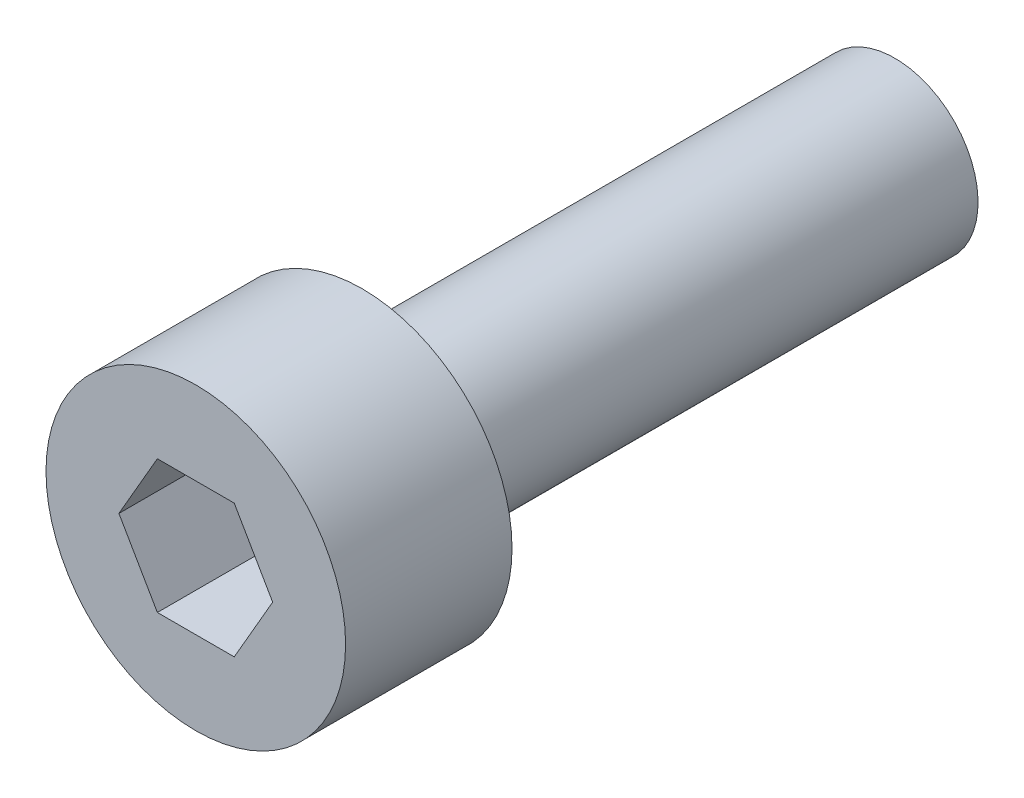
ISO-10303-21;
HEADER;
FILE_DESCRIPTION(('STEP AP214'),'2;1');
FILE_NAME('part.step','',(''),(''),'','','');
FILE_SCHEMA(('AUTOMOTIVE_DESIGN { 1 0 10303 214 1 1 1 1 }'));
ENDSEC;
DATA;
#1=APPLICATION_CONTEXT('core data for automotive mechanical design processes');
#2=APPLICATION_PROTOCOL_DEFINITION('international standard','automotive_design',2000,#1);
#3=PRODUCT_CONTEXT('',#1,'mechanical');
#4=PRODUCT('Part','Part','',(#3));
#5=PRODUCT_RELATED_PRODUCT_CATEGORY('part','',(#4));
#6=PRODUCT_DEFINITION_FORMATION('','',#4);
#7=PRODUCT_DEFINITION_CONTEXT('part definition',#1,'design');
#8=PRODUCT_DEFINITION('design','',#6,#7);
#9=PRODUCT_DEFINITION_SHAPE('','',#8);
#10=(LENGTH_UNIT() NAMED_UNIT(*) SI_UNIT(.MILLI.,.METRE.));
#11=(NAMED_UNIT(*) PLANE_ANGLE_UNIT() SI_UNIT($,.RADIAN.));
#12=(NAMED_UNIT(*) SI_UNIT($,.STERADIAN.) SOLID_ANGLE_UNIT());
#13=UNCERTAINTY_MEASURE_WITH_UNIT(LENGTH_MEASURE(1.E-05),#10,'distance_accuracy_value','');
#14=(GEOMETRIC_REPRESENTATION_CONTEXT(3) GLOBAL_UNCERTAINTY_ASSIGNED_CONTEXT((#13)) GLOBAL_UNIT_ASSIGNED_CONTEXT((#10,
#11,#12)) REPRESENTATION_CONTEXT('',''));
#15=CARTESIAN_POINT('',(0.,0.,0.));
#16=DIRECTION('',(0.,0.,1.));
#17=DIRECTION('',(1.,0.,0.));
#18=AXIS2_PLACEMENT_3D('',#15,#16,#17);
#19=CARTESIAN_POINT('',(0.,0.,2.5));
#20=DIRECTION('',(0.,0.,-1.));
#21=DIRECTION('',(0.,1.,0.));
#22=AXIS2_PLACEMENT_3D('',#19,#20,#21);
#23=PLANE('',#22);
#24=DIRECTION('',(0.5,0.866025403784439,0.));
#25=VECTOR('',#24,1.);
#26=CARTESIAN_POINT('',(0.577350269189626,-1.,2.5));
#27=LINE('',#26,#25);
#28=CARTESIAN_POINT('',(0.577350269189626,-1.,2.5));
#29=VERTEX_POINT('',#28);
#30=CARTESIAN_POINT('',(1.15470053837925,0.,2.5));
#31=VERTEX_POINT('',#30);
#32=EDGE_CURVE('E124',#29,#31,#27,.T.);
#33=ORIENTED_EDGE('',*,*,#32,.F.);
#34=DIRECTION('',(1.,0.,0.));
#35=VECTOR('',#34,1.);
#36=CARTESIAN_POINT('',(-0.577350269189626,-1.,2.5));
#37=LINE('',#36,#35);
#38=CARTESIAN_POINT('',(-0.577350269189626,-1.,2.5));
#39=VERTEX_POINT('',#38);
#40=EDGE_CURVE('E50',#39,#29,#37,.T.);
#41=ORIENTED_EDGE('',*,*,#40,.F.);
#42=DIRECTION('',(0.5,-0.866025403784439,0.));
#43=VECTOR('',#42,1.);
#44=CARTESIAN_POINT('',(-1.15470053837925,0.,2.5));
#45=LINE('',#44,#43);
#46=CARTESIAN_POINT('',(-1.15470053837925,0.,2.5));
#47=VERTEX_POINT('',#46);
#48=EDGE_CURVE('E133',#47,#39,#45,.T.);
#49=ORIENTED_EDGE('',*,*,#48,.F.);
#50=DIRECTION('',(-0.5,-0.866025403784439,0.));
#51=VECTOR('',#50,1.);
#52=CARTESIAN_POINT('',(-0.577350269189626,1.,2.5));
#53=LINE('',#52,#51);
#54=CARTESIAN_POINT('',(-0.577350269189626,1.,2.5));
#55=VERTEX_POINT('',#54);
#56=EDGE_CURVE('E131',#55,#47,#53,.T.);
#57=ORIENTED_EDGE('',*,*,#56,.F.);
#58=DIRECTION('',(-1.,0.,0.));
#59=VECTOR('',#58,1.);
#60=CARTESIAN_POINT('',(0.577350269189626,1.,2.5));
#61=LINE('',#60,#59);
#62=CARTESIAN_POINT('',(0.577350269189626,1.,2.5));
#63=VERTEX_POINT('',#62);
#64=EDGE_CURVE('E98',#63,#55,#61,.T.);
#65=ORIENTED_EDGE('',*,*,#64,.F.);
#66=DIRECTION('',(-0.5,0.866025403784439,0.));
#67=VECTOR('',#66,1.);
#68=CARTESIAN_POINT('',(1.15470053837925,0.,2.5));
#69=LINE('',#68,#67);
#70=EDGE_CURVE('E127',#31,#63,#69,.T.);
#71=ORIENTED_EDGE('',*,*,#70,.F.);
#72=EDGE_LOOP('',(#33,#41,#49,#57,#65,#71));
#73=FACE_BOUND('',#72,.T.);
#74=CARTESIAN_POINT('',(0.,0.,2.5));
#75=DIRECTION('',(0.,0.,1.));
#76=DIRECTION('',(0.,-1.,0.));
#77=AXIS2_PLACEMENT_3D('',#74,#75,#76);
#78=CIRCLE('',#77,2.25);
#79=CARTESIAN_POINT('',(0.,-2.25,2.5));
#80=VERTEX_POINT('',#79);
#81=EDGE_CURVE('E11',#80,#80,#78,.T.);
#82=ORIENTED_EDGE('',*,*,#81,.T.);
#83=EDGE_LOOP('',(#82));
#84=FACE_BOUND('',#83,.T.);
#85=ADVANCED_FACE('F36',(#73,#84),#23,.F.);
#86=CARTESIAN_POINT('',(0.,0.,5.58488227818494));
#87=DIRECTION('',(0.,0.,1.));
#88=DIRECTION('',(0.,-1.,0.));
#89=AXIS2_PLACEMENT_3D('',#86,#87,#88);
#90=CYLINDRICAL_SURFACE('',#89,2.25);
#91=ORIENTED_EDGE('',*,*,#81,.F.);
#92=EDGE_LOOP('',(#91));
#93=FACE_BOUND('',#92,.T.);
#94=CARTESIAN_POINT('',(0.,0.,0.));
#95=DIRECTION('',(0.,0.,1.));
#96=DIRECTION('',(0.,-1.,0.));
#97=AXIS2_PLACEMENT_3D('',#94,#95,#96);
#98=CIRCLE('',#97,2.25);
#99=CARTESIAN_POINT('',(0.,-2.25,0.));
#100=VERTEX_POINT('',#99);
#101=EDGE_CURVE('E43',#100,#100,#98,.T.);
#102=ORIENTED_EDGE('',*,*,#101,.T.);
#103=EDGE_LOOP('',(#102));
#104=FACE_BOUND('',#103,.T.);
#105=ADVANCED_FACE('F150',(#93,#104),#90,.T.);
#106=CARTESIAN_POINT('',(0.,2.25,0.));
#107=DIRECTION('',(0.,0.,1.));
#108=DIRECTION('',(0.,-1.,0.));
#109=AXIS2_PLACEMENT_3D('',#106,#107,#108);
#110=PLANE('',#109);
#111=ORIENTED_EDGE('',*,*,#101,.F.);
#112=EDGE_LOOP('',(#111));
#113=FACE_BOUND('',#112,.T.);
#114=CARTESIAN_POINT('',(0.,0.,0.));
#115=DIRECTION('',(0.,0.,1.));
#116=DIRECTION('',(0.,-1.,0.));
#117=AXIS2_PLACEMENT_3D('',#114,#115,#116);
#118=CIRCLE('',#117,1.25);
#119=CARTESIAN_POINT('',(0.,-1.25,0.));
#120=VERTEX_POINT('',#119);
#121=EDGE_CURVE('E145',#120,#120,#118,.T.);
#122=ORIENTED_EDGE('',*,*,#121,.T.);
#123=EDGE_LOOP('',(#122));
#124=FACE_BOUND('',#123,.T.);
#125=ADVANCED_FACE('F152',(#113,#124),#110,.F.);
#126=CARTESIAN_POINT('',(0.,0.,5.58488227818494));
#127=DIRECTION('',(0.,0.,1.));
#128=DIRECTION('',(0.,-1.,0.));
#129=AXIS2_PLACEMENT_3D('',#126,#127,#128);
#130=CYLINDRICAL_SURFACE('',#129,1.25);
#131=ORIENTED_EDGE('',*,*,#121,.F.);
#132=EDGE_LOOP('',(#131));
#133=FACE_BOUND('',#132,.T.);
#134=CARTESIAN_POINT('',(0.,0.,-8.));
#135=DIRECTION('',(0.,0.,1.));
#136=DIRECTION('',(0.,-1.,0.));
#137=AXIS2_PLACEMENT_3D('',#134,#135,#136);
#138=CIRCLE('',#137,1.25);
#139=CARTESIAN_POINT('',(0.,-1.25,-8.));
#140=VERTEX_POINT('',#139);
#141=EDGE_CURVE('E137',#140,#140,#138,.T.);
#142=ORIENTED_EDGE('',*,*,#141,.T.);
#143=EDGE_LOOP('',(#142));
#144=FACE_BOUND('',#143,.T.);
#145=ADVANCED_FACE('F155',(#133,#144),#130,.T.);
#146=CARTESIAN_POINT('',(0.,1.25,-8.));
#147=DIRECTION('',(0.,0.,1.));
#148=DIRECTION('',(0.,-1.,0.));
#149=AXIS2_PLACEMENT_3D('',#146,#147,#148);
#150=PLANE('',#149);
#151=ORIENTED_EDGE('',*,*,#141,.F.);
#152=EDGE_LOOP('',(#151));
#153=FACE_BOUND('',#152,.T.);
#154=ADVANCED_FACE('F161',(#153),#150,.F.);
#155=CARTESIAN_POINT('',(-0.577350269189626,-1.,1.));
#156=DIRECTION('',(0.,-1.,0.));
#157=DIRECTION('',(1.,0.,0.));
#158=AXIS2_PLACEMENT_3D('',#155,#156,#157);
#159=PLANE('',#158);
#160=ORIENTED_EDGE('',*,*,#40,.T.);
#161=DIRECTION('',(0.,0.,1.));
#162=VECTOR('',#161,1.);
#163=CARTESIAN_POINT('',(0.577350269189626,-1.,1.));
#164=LINE('',#163,#162);
#165=CARTESIAN_POINT('',(0.577350269189626,-1.,1.));
#166=VERTEX_POINT('',#165);
#167=EDGE_CURVE('E80',#166,#29,#164,.T.);
#168=ORIENTED_EDGE('',*,*,#167,.F.);
#169=DIRECTION('',(1.,0.,0.));
#170=VECTOR('',#169,1.);
#171=CARTESIAN_POINT('',(-0.577350269189626,-1.,1.));
#172=LINE('',#171,#170);
#173=CARTESIAN_POINT('',(-0.577350269189626,-1.,1.));
#174=VERTEX_POINT('',#173);
#175=EDGE_CURVE('E135',#174,#166,#172,.T.);
#176=ORIENTED_EDGE('',*,*,#175,.F.);
#177=DIRECTION('',(0.,0.,1.));
#178=VECTOR('',#177,1.);
#179=CARTESIAN_POINT('',(-0.577350269189626,-1.,1.));
#180=LINE('',#179,#178);
#181=EDGE_CURVE('E58',#174,#39,#180,.T.);
#182=ORIENTED_EDGE('',*,*,#181,.T.);
#183=EDGE_LOOP('',(#160,#168,#176,#182));
#184=FACE_BOUND('',#183,.T.);
#185=ADVANCED_FACE('F166',(#184),#159,.F.);
#186=CARTESIAN_POINT('',(-1.15470053837925,0.,1.));
#187=DIRECTION('',(-0.866025403784439,-0.5,0.));
#188=DIRECTION('',(0.5,-0.866025403784439,0.));
#189=AXIS2_PLACEMENT_3D('',#186,#187,#188);
#190=PLANE('',#189);
#191=ORIENTED_EDGE('',*,*,#48,.T.);
#192=ORIENTED_EDGE('',*,*,#181,.F.);
#193=DIRECTION('',(0.5,-0.866025403784439,0.));
#194=VECTOR('',#193,1.);
#195=CARTESIAN_POINT('',(-1.15470053837925,0.,1.));
#196=LINE('',#195,#194);
#197=CARTESIAN_POINT('',(-1.15470053837925,0.,1.));
#198=VERTEX_POINT('',#197);
#199=EDGE_CURVE('E110',#198,#174,#196,.T.);
#200=ORIENTED_EDGE('',*,*,#199,.F.);
#201=DIRECTION('',(0.,0.,1.));
#202=VECTOR('',#201,1.);
#203=CARTESIAN_POINT('',(-1.15470053837925,0.,1.));
#204=LINE('',#203,#202);
#205=EDGE_CURVE('E102',#198,#47,#204,.T.);
#206=ORIENTED_EDGE('',*,*,#205,.T.);
#207=EDGE_LOOP('',(#191,#192,#200,#206));
#208=FACE_BOUND('',#207,.T.);
#209=ADVANCED_FACE('F171',(#208),#190,.F.);
#210=CARTESIAN_POINT('',(-0.577350269189626,1.,1.));
#211=DIRECTION('',(-0.866025403784439,0.5,0.));
#212=DIRECTION('',(-0.5,-0.866025403784439,0.));
#213=AXIS2_PLACEMENT_3D('',#210,#211,#212);
#214=PLANE('',#213);
#215=ORIENTED_EDGE('',*,*,#56,.T.);
#216=ORIENTED_EDGE('',*,*,#205,.F.);
#217=DIRECTION('',(-0.5,-0.866025403784439,0.));
#218=VECTOR('',#217,1.);
#219=CARTESIAN_POINT('',(-0.577350269189626,1.,1.));
#220=LINE('',#219,#218);
#221=CARTESIAN_POINT('',(-0.577350269189626,1.,1.));
#222=VERTEX_POINT('',#221);
#223=EDGE_CURVE('E106',#222,#198,#220,.T.);
#224=ORIENTED_EDGE('',*,*,#223,.F.);
#225=DIRECTION('',(0.,0.,1.));
#226=VECTOR('',#225,1.);
#227=CARTESIAN_POINT('',(-0.577350269189626,1.,1.));
#228=LINE('',#227,#226);
#229=EDGE_CURVE('E91',#222,#55,#228,.T.);
#230=ORIENTED_EDGE('',*,*,#229,.T.);
#231=EDGE_LOOP('',(#215,#216,#224,#230));
#232=FACE_BOUND('',#231,.T.);
#233=ADVANCED_FACE('F107',(#232),#214,.F.);
#234=CARTESIAN_POINT('',(0.577350269189626,1.,1.));
#235=DIRECTION('',(0.,1.,0.));
#236=DIRECTION('',(0.,0.,1.));
#237=AXIS2_PLACEMENT_3D('',#234,#235,#236);
#238=PLANE('',#237);
#239=ORIENTED_EDGE('',*,*,#64,.T.);
#240=ORIENTED_EDGE('',*,*,#229,.F.);
#241=DIRECTION('',(-1.,0.,0.));
#242=VECTOR('',#241,1.);
#243=CARTESIAN_POINT('',(0.577350269189626,1.,1.));
#244=LINE('',#243,#242);
#245=CARTESIAN_POINT('',(0.577350269189626,1.,1.));
#246=VERTEX_POINT('',#245);
#247=EDGE_CURVE('E95',#246,#222,#244,.T.);
#248=ORIENTED_EDGE('',*,*,#247,.F.);
#249=DIRECTION('',(0.,0.,1.));
#250=VECTOR('',#249,1.);
#251=CARTESIAN_POINT('',(0.577350269189626,1.,1.));
#252=LINE('',#251,#250);
#253=EDGE_CURVE('E103',#246,#63,#252,.T.);
#254=ORIENTED_EDGE('',*,*,#253,.T.);
#255=EDGE_LOOP('',(#239,#240,#248,#254));
#256=FACE_BOUND('',#255,.T.);
#257=ADVANCED_FACE('F93',(#256),#238,.F.);
#258=CARTESIAN_POINT('',(1.15470053837925,0.,1.));
#259=DIRECTION('',(0.866025403784439,0.5,0.));
#260=DIRECTION('',(-0.5,0.866025403784439,0.));
#261=AXIS2_PLACEMENT_3D('',#258,#259,#260);
#262=PLANE('',#261);
#263=ORIENTED_EDGE('',*,*,#70,.T.);
#264=ORIENTED_EDGE('',*,*,#253,.F.);
#265=DIRECTION('',(-0.5,0.866025403784439,0.));
#266=VECTOR('',#265,1.);
#267=CARTESIAN_POINT('',(1.15470053837925,0.,1.));
#268=LINE('',#267,#266);
#269=CARTESIAN_POINT('',(1.15470053837925,0.,1.));
#270=VERTEX_POINT('',#269);
#271=EDGE_CURVE('E116',#270,#246,#268,.T.);
#272=ORIENTED_EDGE('',*,*,#271,.F.);
#273=DIRECTION('',(0.,0.,1.));
#274=VECTOR('',#273,1.);
#275=CARTESIAN_POINT('',(1.15470053837925,0.,1.));
#276=LINE('',#275,#274);
#277=EDGE_CURVE('E140',#270,#31,#276,.T.);
#278=ORIENTED_EDGE('',*,*,#277,.T.);
#279=EDGE_LOOP('',(#263,#264,#272,#278));
#280=FACE_BOUND('',#279,.T.);
#281=ADVANCED_FACE('F197',(#280),#262,.F.);
#282=CARTESIAN_POINT('',(0.577350269189626,-1.,1.));
#283=DIRECTION('',(0.866025403784439,-0.5,0.));
#284=DIRECTION('',(0.5,0.866025403784439,0.));
#285=AXIS2_PLACEMENT_3D('',#282,#283,#284);
#286=PLANE('',#285);
#287=ORIENTED_EDGE('',*,*,#32,.T.);
#288=ORIENTED_EDGE('',*,*,#277,.F.);
#289=DIRECTION('',(0.5,0.866025403784439,0.));
#290=VECTOR('',#289,1.);
#291=CARTESIAN_POINT('',(0.577350269189626,-1.,1.));
#292=LINE('',#291,#290);
#293=EDGE_CURVE('E118',#166,#270,#292,.T.);
#294=ORIENTED_EDGE('',*,*,#293,.F.);
#295=ORIENTED_EDGE('',*,*,#167,.T.);
#296=EDGE_LOOP('',(#287,#288,#294,#295));
#297=FACE_BOUND('',#296,.T.);
#298=ADVANCED_FACE('F185',(#297),#286,.F.);
#299=CARTESIAN_POINT('',(-0.577350269189626,-1.,1.));
#300=DIRECTION('',(0.,0.,-1.));
#301=DIRECTION('',(-1.,0.,0.));
#302=AXIS2_PLACEMENT_3D('',#299,#300,#301);
#303=PLANE('',#302);
#304=ORIENTED_EDGE('',*,*,#175,.T.);
#305=ORIENTED_EDGE('',*,*,#293,.T.);
#306=ORIENTED_EDGE('',*,*,#271,.T.);
#307=ORIENTED_EDGE('',*,*,#247,.T.);
#308=ORIENTED_EDGE('',*,*,#223,.T.);
#309=ORIENTED_EDGE('',*,*,#199,.T.);
#310=EDGE_LOOP('',(#304,#305,#306,#307,#308,#309));
#311=FACE_BOUND('',#310,.T.);
#312=ADVANCED_FACE('F113',(#311),#303,.F.);
#313=CLOSED_SHELL('',(#85,#105,#125,#145,#154,#185,#209,#233,#257,#281,#298,#312));
#314=MANIFOLD_SOLID_BREP('B2',#313);
#315=ADVANCED_BREP_SHAPE_REPRESENTATION('',(#18,#314),#14);
#316=SHAPE_DEFINITION_REPRESENTATION(#9,#315);
ENDSEC;
END-ISO-10303-21;
